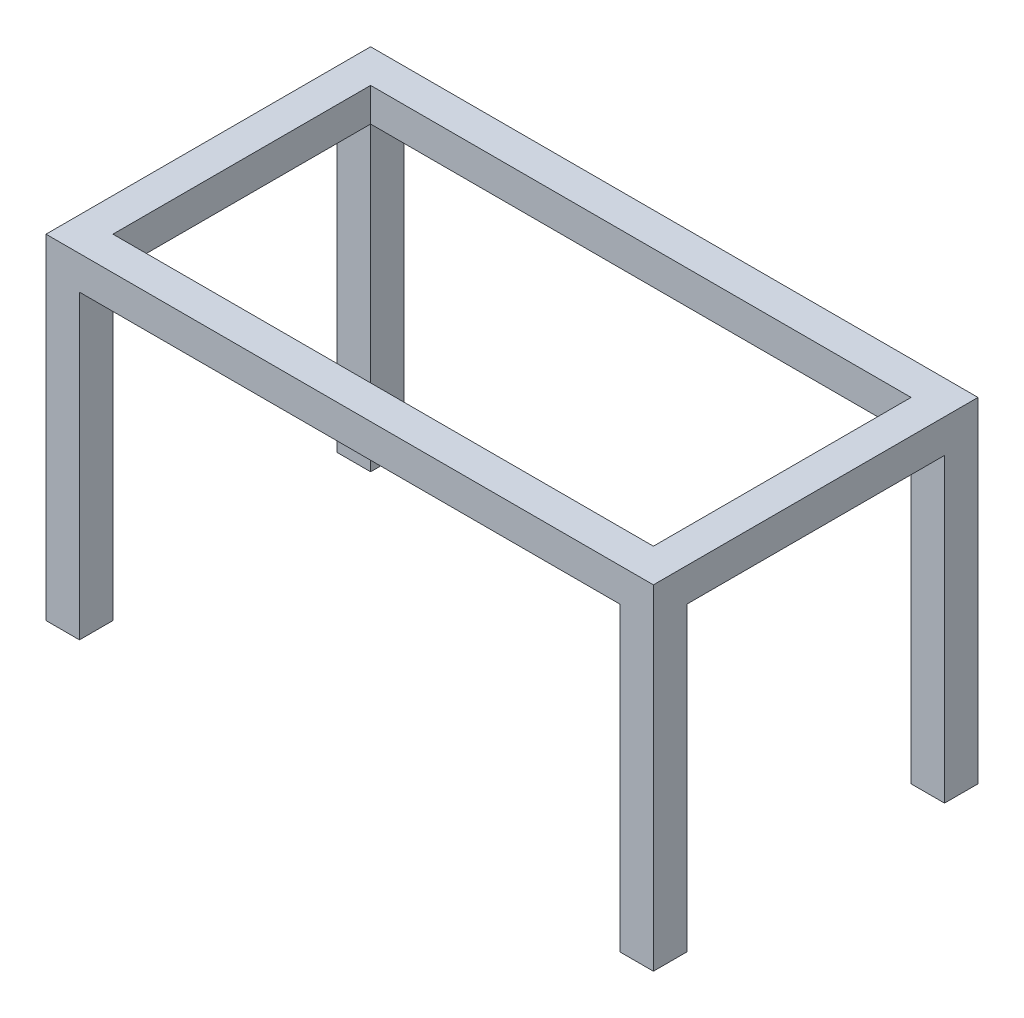
ISO-10303-21;
HEADER;
FILE_DESCRIPTION(('STEP AP214'),'2;1');
FILE_NAME('part.step','',(''),(''),'','','');
FILE_SCHEMA(('AUTOMOTIVE_DESIGN { 1 0 10303 214 1 1 1 1 }'));
ENDSEC;
DATA;
#1=APPLICATION_CONTEXT('core data for automotive mechanical design processes');
#2=APPLICATION_PROTOCOL_DEFINITION('international standard','automotive_design',2000,#1);
#3=PRODUCT_CONTEXT('',#1,'mechanical');
#4=PRODUCT('Part','Part','',(#3));
#5=PRODUCT_RELATED_PRODUCT_CATEGORY('part','',(#4));
#6=PRODUCT_DEFINITION_FORMATION('','',#4);
#7=PRODUCT_DEFINITION_CONTEXT('part definition',#1,'design');
#8=PRODUCT_DEFINITION('design','',#6,#7);
#9=PRODUCT_DEFINITION_SHAPE('','',#8);
#10=(LENGTH_UNIT() NAMED_UNIT(*) SI_UNIT(.MILLI.,.METRE.));
#11=(NAMED_UNIT(*) PLANE_ANGLE_UNIT() SI_UNIT($,.RADIAN.));
#12=(NAMED_UNIT(*) SI_UNIT($,.STERADIAN.) SOLID_ANGLE_UNIT());
#13=UNCERTAINTY_MEASURE_WITH_UNIT(LENGTH_MEASURE(1.E-05),#10,'distance_accuracy_value','');
#14=(GEOMETRIC_REPRESENTATION_CONTEXT(3) GLOBAL_UNCERTAINTY_ASSIGNED_CONTEXT((#13)) GLOBAL_UNIT_ASSIGNED_CONTEXT((#10,
#11,#12)) REPRESENTATION_CONTEXT('',''));
#15=CARTESIAN_POINT('',(0.,0.,0.));
#16=DIRECTION('',(0.,0.,1.));
#17=DIRECTION('',(1.,0.,0.));
#18=AXIS2_PLACEMENT_3D('',#15,#16,#17);
#19=CARTESIAN_POINT('',(-40.375,50.,-19.25));
#20=DIRECTION('',(0.,0.,-1.));
#21=DIRECTION('',(-1.,0.,0.));
#22=AXIS2_PLACEMENT_3D('',#19,#20,#21);
#23=PLANE('',#22);
#24=DIRECTION('',(1.,0.,0.));
#25=VECTOR('',#24,1.);
#26=CARTESIAN_POINT('',(40.375,45.,-19.25));
#27=LINE('',#26,#25);
#28=CARTESIAN_POINT('',(40.375,45.,-19.25));
#29=VERTEX_POINT('',#28);
#30=CARTESIAN_POINT('',(45.375,45.,-19.25));
#31=VERTEX_POINT('',#30);
#32=EDGE_CURVE('E54',#29,#31,#27,.T.);
#33=ORIENTED_EDGE('',*,*,#32,.F.);
#34=DIRECTION('',(0.,-1.,0.));
#35=VECTOR('',#34,1.);
#36=CARTESIAN_POINT('',(40.375,50.,-19.25));
#37=LINE('',#36,#35);
#38=CARTESIAN_POINT('',(40.375,0.,-19.25));
#39=VERTEX_POINT('',#38);
#40=EDGE_CURVE('E243',#29,#39,#37,.T.);
#41=ORIENTED_EDGE('',*,*,#40,.T.);
#42=DIRECTION('',(1.,0.,0.));
#43=VECTOR('',#42,1.);
#44=CARTESIAN_POINT('',(40.375,0.,-19.25));
#45=LINE('',#44,#43);
#46=CARTESIAN_POINT('',(45.375,0.,-19.25));
#47=VERTEX_POINT('',#46);
#48=EDGE_CURVE('E230',#39,#47,#45,.T.);
#49=ORIENTED_EDGE('',*,*,#48,.T.);
#50=DIRECTION('',(0.,-1.,0.));
#51=VECTOR('',#50,1.);
#52=CARTESIAN_POINT('',(45.375,50.,-19.25));
#53=LINE('',#52,#51);
#54=EDGE_CURVE('E241',#31,#47,#53,.T.);
#55=ORIENTED_EDGE('',*,*,#54,.F.);
#56=EDGE_LOOP('',(#33,#41,#49,#55));
#57=FACE_BOUND('',#56,.T.);
#58=ADVANCED_FACE('F37',(#57),#23,.F.);
#59=DIRECTION('',(0.,-1.,0.));
#60=VECTOR('',#59,1.);
#61=CARTESIAN_POINT('',(40.375,45.,-19.25));
#62=LINE('',#61,#60);
#63=CARTESIAN_POINT('',(40.375,50.,-19.25));
#64=VERTEX_POINT('',#63);
#65=EDGE_CURVE('E193',#64,#29,#62,.T.);
#66=ORIENTED_EDGE('',*,*,#65,.F.);
#67=DIRECTION('',(1.,0.,0.));
#68=VECTOR('',#67,1.);
#69=CARTESIAN_POINT('',(-40.375,50.,-19.25));
#70=LINE('',#69,#68);
#71=CARTESIAN_POINT('',(-40.375,50.,-19.25));
#72=VERTEX_POINT('',#71);
#73=EDGE_CURVE('E265',#72,#64,#70,.T.);
#74=ORIENTED_EDGE('',*,*,#73,.F.);
#75=DIRECTION('',(0.,1.,0.));
#76=VECTOR('',#75,1.);
#77=CARTESIAN_POINT('',(-40.375,50.,-19.25));
#78=LINE('',#77,#76);
#79=CARTESIAN_POINT('',(-40.375,45.,-19.25));
#80=VERTEX_POINT('',#79);
#81=EDGE_CURVE('E285',#80,#72,#78,.T.);
#82=ORIENTED_EDGE('',*,*,#81,.F.);
#83=DIRECTION('',(-1.,0.,0.));
#84=VECTOR('',#83,1.);
#85=CARTESIAN_POINT('',(45.377,45.,-19.25));
#86=LINE('',#85,#84);
#87=EDGE_CURVE('E249',#29,#80,#86,.T.);
#88=ORIENTED_EDGE('',*,*,#87,.F.);
#89=EDGE_LOOP('',(#66,#74,#82,#88));
#90=FACE_BOUND('',#89,.T.);
#91=ADVANCED_FACE('F327',(#90),#23,.F.);
#92=CARTESIAN_POINT('',(45.377,50.,19.25));
#93=DIRECTION('',(0.,0.,1.));
#94=DIRECTION('',(1.,0.,0.));
#95=AXIS2_PLACEMENT_3D('',#92,#93,#94);
#96=PLANE('',#95);
#97=DIRECTION('',(1.,0.,0.));
#98=VECTOR('',#97,1.);
#99=CARTESIAN_POINT('',(40.375,45.,19.25));
#100=LINE('',#99,#98);
#101=CARTESIAN_POINT('',(40.375,45.,19.25));
#102=VERTEX_POINT('',#101);
#103=CARTESIAN_POINT('',(45.375,45.,19.25));
#104=VERTEX_POINT('',#103);
#105=EDGE_CURVE('E180',#102,#104,#100,.T.);
#106=ORIENTED_EDGE('',*,*,#105,.T.);
#107=DIRECTION('',(0.,-1.,0.));
#108=VECTOR('',#107,1.);
#109=CARTESIAN_POINT('',(45.375,50.,19.25));
#110=LINE('',#109,#108);
#111=CARTESIAN_POINT('',(45.375,0.,19.25));
#112=VERTEX_POINT('',#111);
#113=EDGE_CURVE('E164',#104,#112,#110,.T.);
#114=ORIENTED_EDGE('',*,*,#113,.T.);
#115=DIRECTION('',(-1.,0.,0.));
#116=VECTOR('',#115,1.);
#117=CARTESIAN_POINT('',(40.375,0.,19.25));
#118=LINE('',#117,#116);
#119=CARTESIAN_POINT('',(40.375,0.,19.25));
#120=VERTEX_POINT('',#119);
#121=EDGE_CURVE('E201',#112,#120,#118,.T.);
#122=ORIENTED_EDGE('',*,*,#121,.T.);
#123=DIRECTION('',(0.,-1.,0.));
#124=VECTOR('',#123,1.);
#125=CARTESIAN_POINT('',(40.375,50.,19.25));
#126=LINE('',#125,#124);
#127=EDGE_CURVE('E175',#102,#120,#126,.T.);
#128=ORIENTED_EDGE('',*,*,#127,.F.);
#129=EDGE_LOOP('',(#106,#114,#122,#128));
#130=FACE_BOUND('',#129,.T.);
#131=ADVANCED_FACE('F181',(#130),#96,.F.);
#132=DIRECTION('',(0.,-1.,0.));
#133=VECTOR('',#132,1.);
#134=CARTESIAN_POINT('',(40.375,50.,19.25));
#135=LINE('',#134,#133);
#136=CARTESIAN_POINT('',(40.375,50.,19.25));
#137=VERTEX_POINT('',#136);
#138=EDGE_CURVE('E183',#137,#102,#135,.T.);
#139=ORIENTED_EDGE('',*,*,#138,.T.);
#140=DIRECTION('',(-1.,0.,0.));
#141=VECTOR('',#140,1.);
#142=CARTESIAN_POINT('',(45.377,45.,19.25));
#143=LINE('',#142,#141);
#144=CARTESIAN_POINT('',(-40.375,45.,19.25));
#145=VERTEX_POINT('',#144);
#146=EDGE_CURVE('E215',#102,#145,#143,.T.);
#147=ORIENTED_EDGE('',*,*,#146,.T.);
#148=DIRECTION('',(0.,1.,0.));
#149=VECTOR('',#148,1.);
#150=CARTESIAN_POINT('',(-40.375,50.,19.25));
#151=LINE('',#150,#149);
#152=CARTESIAN_POINT('',(-40.375,50.,19.25));
#153=VERTEX_POINT('',#152);
#154=EDGE_CURVE('E214',#145,#153,#151,.T.);
#155=ORIENTED_EDGE('',*,*,#154,.T.);
#156=DIRECTION('',(-1.,0.,0.));
#157=VECTOR('',#156,1.);
#158=CARTESIAN_POINT('',(45.377,50.,19.25));
#159=LINE('',#158,#157);
#160=EDGE_CURVE('E62',#137,#153,#159,.T.);
#161=ORIENTED_EDGE('',*,*,#160,.F.);
#162=EDGE_LOOP('',(#139,#147,#155,#161));
#163=FACE_BOUND('',#162,.T.);
#164=ADVANCED_FACE('F430',(#163),#96,.F.);
#165=CARTESIAN_POINT('',(-40.375,50.,19.25));
#166=DIRECTION('',(-1.,0.,0.));
#167=DIRECTION('',(0.,0.,1.));
#168=AXIS2_PLACEMENT_3D('',#165,#166,#167);
#169=PLANE('',#168);
#170=DIRECTION('',(0.,0.,-1.));
#171=VECTOR('',#170,1.);
#172=CARTESIAN_POINT('',(-40.375,45.,24.25));
#173=LINE('',#172,#171);
#174=CARTESIAN_POINT('',(-40.375,45.,24.25));
#175=VERTEX_POINT('',#174);
#176=EDGE_CURVE('E219',#175,#145,#173,.T.);
#177=ORIENTED_EDGE('',*,*,#176,.F.);
#178=DIRECTION('',(0.,-1.,0.));
#179=VECTOR('',#178,1.);
#180=CARTESIAN_POINT('',(-40.375,50.,24.25));
#181=LINE('',#180,#179);
#182=CARTESIAN_POINT('',(-40.375,0.,24.25));
#183=VERTEX_POINT('',#182);
#184=EDGE_CURVE('E304',#175,#183,#181,.T.);
#185=ORIENTED_EDGE('',*,*,#184,.T.);
#186=DIRECTION('',(0.,0.,-1.));
#187=VECTOR('',#186,1.);
#188=CARTESIAN_POINT('',(-40.375,0.,19.25));
#189=LINE('',#188,#187);
#190=CARTESIAN_POINT('',(-40.375,0.,19.25));
#191=VERTEX_POINT('',#190);
#192=EDGE_CURVE('E11',#183,#191,#189,.T.);
#193=ORIENTED_EDGE('',*,*,#192,.T.);
#194=DIRECTION('',(0.,-1.,0.));
#195=VECTOR('',#194,1.);
#196=CARTESIAN_POINT('',(-40.375,50.,19.25));
#197=LINE('',#196,#195);
#198=EDGE_CURVE('E297',#145,#191,#197,.T.);
#199=ORIENTED_EDGE('',*,*,#198,.F.);
#200=EDGE_LOOP('',(#177,#185,#193,#199));
#201=FACE_BOUND('',#200,.T.);
#202=ADVANCED_FACE('F388',(#201),#169,.F.);
#203=ORIENTED_EDGE('',*,*,#154,.F.);
#204=DIRECTION('',(0.,0.,-1.));
#205=VECTOR('',#204,1.);
#206=CARTESIAN_POINT('',(-40.375,45.,24.252));
#207=LINE('',#206,#205);
#208=EDGE_CURVE('E288',#145,#80,#207,.T.);
#209=ORIENTED_EDGE('',*,*,#208,.T.);
#210=ORIENTED_EDGE('',*,*,#81,.T.);
#211=DIRECTION('',(0.,0.,-1.));
#212=VECTOR('',#211,1.);
#213=CARTESIAN_POINT('',(-40.375,50.,19.25));
#214=LINE('',#213,#212);
#215=EDGE_CURVE('E41',#153,#72,#214,.T.);
#216=ORIENTED_EDGE('',*,*,#215,.F.);
#217=EDGE_LOOP('',(#203,#209,#210,#216));
#218=FACE_BOUND('',#217,.T.);
#219=ADVANCED_FACE('F329',(#218),#169,.F.);
#220=CARTESIAN_POINT('',(-40.375,50.,19.25));
#221=DIRECTION('',(0.,0.,1.));
#222=DIRECTION('',(1.,0.,0.));
#223=AXIS2_PLACEMENT_3D('',#220,#221,#222);
#224=PLANE('',#223);
#225=DIRECTION('',(0.,-1.,0.));
#226=VECTOR('',#225,1.);
#227=CARTESIAN_POINT('',(-45.375,50.,19.25));
#228=LINE('',#227,#226);
#229=CARTESIAN_POINT('',(-45.375,45.,19.25));
#230=VERTEX_POINT('',#229);
#231=CARTESIAN_POINT('',(-45.375,0.,19.25));
#232=VERTEX_POINT('',#231);
#233=EDGE_CURVE('E299',#230,#232,#228,.T.);
#234=ORIENTED_EDGE('',*,*,#233,.F.);
#235=DIRECTION('',(1.,0.,0.));
#236=VECTOR('',#235,1.);
#237=CARTESIAN_POINT('',(-45.375,45.,19.25));
#238=LINE('',#237,#236);
#239=EDGE_CURVE('E292',#230,#145,#238,.T.);
#240=ORIENTED_EDGE('',*,*,#239,.T.);
#241=ORIENTED_EDGE('',*,*,#198,.T.);
#242=DIRECTION('',(-1.,0.,0.));
#243=VECTOR('',#242,1.);
#244=CARTESIAN_POINT('',(-40.375,0.,19.25));
#245=LINE('',#244,#243);
#246=EDGE_CURVE('E46',#191,#232,#245,.T.);
#247=ORIENTED_EDGE('',*,*,#246,.T.);
#248=EDGE_LOOP('',(#234,#240,#241,#247));
#249=FACE_BOUND('',#248,.T.);
#250=ADVANCED_FACE('F392',(#249),#224,.F.);
#251=CARTESIAN_POINT('',(-45.375,50.,19.25));
#252=DIRECTION('',(1.,0.,0.));
#253=DIRECTION('',(0.,0.,-1.));
#254=AXIS2_PLACEMENT_3D('',#251,#252,#253);
#255=PLANE('',#254);
#256=DIRECTION('',(0.,0.,1.));
#257=VECTOR('',#256,1.);
#258=CARTESIAN_POINT('',(-45.375,0.,19.25));
#259=LINE('',#258,#257);
#260=CARTESIAN_POINT('',(-45.375,0.,24.25));
#261=VERTEX_POINT('',#260);
#262=EDGE_CURVE('E310',#232,#261,#259,.T.);
#263=ORIENTED_EDGE('',*,*,#262,.T.);
#264=DIRECTION('',(0.,-1.,0.));
#265=VECTOR('',#264,1.);
#266=CARTESIAN_POINT('',(-45.375,50.,24.25));
#267=LINE('',#266,#265);
#268=CARTESIAN_POINT('',(-45.375,50.,24.25));
#269=VERTEX_POINT('',#268);
#270=EDGE_CURVE('E301',#269,#261,#267,.T.);
#271=ORIENTED_EDGE('',*,*,#270,.F.);
#272=DIRECTION('',(0.,0.,1.));
#273=VECTOR('',#272,1.);
#274=CARTESIAN_POINT('',(-45.375,50.,19.25));
#275=LINE('',#274,#273);
#276=CARTESIAN_POINT('',(-45.375,50.,-24.25));
#277=VERTEX_POINT('',#276);
#278=EDGE_CURVE('E315',#277,#269,#275,.T.);
#279=ORIENTED_EDGE('',*,*,#278,.F.);
#280=DIRECTION('',(0.,-1.,0.));
#281=VECTOR('',#280,1.);
#282=CARTESIAN_POINT('',(-45.375,50.,-24.25));
#283=LINE('',#282,#281);
#284=CARTESIAN_POINT('',(-45.375,0.,-24.25));
#285=VERTEX_POINT('',#284);
#286=EDGE_CURVE('E258',#277,#285,#283,.T.);
#287=ORIENTED_EDGE('',*,*,#286,.T.);
#288=DIRECTION('',(0.,0.,1.));
#289=VECTOR('',#288,1.);
#290=CARTESIAN_POINT('',(-45.375,0.,-19.25));
#291=LINE('',#290,#289);
#292=CARTESIAN_POINT('',(-45.375,0.,-19.25));
#293=VERTEX_POINT('',#292);
#294=EDGE_CURVE('E269',#285,#293,#291,.T.);
#295=ORIENTED_EDGE('',*,*,#294,.T.);
#296=DIRECTION('',(0.,-1.,0.));
#297=VECTOR('',#296,1.);
#298=CARTESIAN_POINT('',(-45.375,50.,-19.25));
#299=LINE('',#298,#297);
#300=CARTESIAN_POINT('',(-45.375,45.,-19.25));
#301=VERTEX_POINT('',#300);
#302=EDGE_CURVE('E261',#301,#293,#299,.T.);
#303=ORIENTED_EDGE('',*,*,#302,.F.);
#304=DIRECTION('',(0.,0.,-1.));
#305=VECTOR('',#304,1.);
#306=CARTESIAN_POINT('',(-45.375,45.,24.252));
#307=LINE('',#306,#305);
#308=EDGE_CURVE('E289',#230,#301,#307,.T.);
#309=ORIENTED_EDGE('',*,*,#308,.F.);
#310=ORIENTED_EDGE('',*,*,#233,.T.);
#311=EDGE_LOOP('',(#263,#271,#279,#287,#295,#303,#309,#310));
#312=FACE_BOUND('',#311,.T.);
#313=ADVANCED_FACE('F340',(#312),#255,.F.);
#314=CARTESIAN_POINT('',(-40.375,50.,24.25));
#315=DIRECTION('',(0.,0.,-1.));
#316=DIRECTION('',(-1.,0.,0.));
#317=AXIS2_PLACEMENT_3D('',#314,#315,#316);
#318=PLANE('',#317);
#319=DIRECTION('',(1.,0.,0.));
#320=VECTOR('',#319,1.);
#321=CARTESIAN_POINT('',(-40.375,0.,24.25));
#322=LINE('',#321,#320);
#323=EDGE_CURVE('E307',#261,#183,#322,.T.);
#324=ORIENTED_EDGE('',*,*,#323,.T.);
#325=ORIENTED_EDGE('',*,*,#184,.F.);
#326=DIRECTION('',(-1.,0.,0.));
#327=VECTOR('',#326,1.);
#328=CARTESIAN_POINT('',(45.377,45.,24.25));
#329=LINE('',#328,#327);
#330=CARTESIAN_POINT('',(40.375,45.,24.25));
#331=VERTEX_POINT('',#330);
#332=EDGE_CURVE('E212',#331,#175,#329,.T.);
#333=ORIENTED_EDGE('',*,*,#332,.F.);
#334=DIRECTION('',(0.,-1.,0.));
#335=VECTOR('',#334,1.);
#336=CARTESIAN_POINT('',(40.375,50.,24.25));
#337=LINE('',#336,#335);
#338=CARTESIAN_POINT('',(40.375,0.,24.25));
#339=VERTEX_POINT('',#338);
#340=EDGE_CURVE('E196',#331,#339,#337,.T.);
#341=ORIENTED_EDGE('',*,*,#340,.T.);
#342=DIRECTION('',(1.,0.,0.));
#343=VECTOR('',#342,1.);
#344=CARTESIAN_POINT('',(40.375,0.,24.25));
#345=LINE('',#344,#343);
#346=CARTESIAN_POINT('',(45.375,0.,24.25));
#347=VERTEX_POINT('',#346);
#348=EDGE_CURVE('E204',#339,#347,#345,.T.);
#349=ORIENTED_EDGE('',*,*,#348,.T.);
#350=DIRECTION('',(0.,-1.,0.));
#351=VECTOR('',#350,1.);
#352=CARTESIAN_POINT('',(45.375,50.,24.25));
#353=LINE('',#352,#351);
#354=CARTESIAN_POINT('',(45.375,50.,24.25));
#355=VERTEX_POINT('',#354);
#356=EDGE_CURVE('E176',#355,#347,#353,.T.);
#357=ORIENTED_EDGE('',*,*,#356,.F.);
#358=DIRECTION('',(1.,0.,0.));
#359=VECTOR('',#358,1.);
#360=CARTESIAN_POINT('',(-40.375,50.,24.25));
#361=LINE('',#360,#359);
#362=EDGE_CURVE('E306',#269,#355,#361,.T.);
#363=ORIENTED_EDGE('',*,*,#362,.F.);
#364=ORIENTED_EDGE('',*,*,#270,.T.);
#365=EDGE_LOOP('',(#324,#325,#333,#341,#349,#357,#363,#364));
#366=FACE_BOUND('',#365,.T.);
#367=ADVANCED_FACE('F384',(#366),#318,.F.);
#368=CARTESIAN_POINT('',(0.,50.,0.));
#369=DIRECTION('',(0.,-1.,0.));
#370=DIRECTION('',(0.,0.,-1.));
#371=AXIS2_PLACEMENT_3D('',#368,#369,#370);
#372=PLANE('',#371);
#373=ORIENTED_EDGE('',*,*,#73,.T.);
#374=DIRECTION('',(0.,0.,-1.));
#375=VECTOR('',#374,1.);
#376=CARTESIAN_POINT('',(40.375,50.,24.252));
#377=LINE('',#376,#375);
#378=EDGE_CURVE('E186',#137,#64,#377,.T.);
#379=ORIENTED_EDGE('',*,*,#378,.F.);
#380=ORIENTED_EDGE('',*,*,#160,.T.);
#381=ORIENTED_EDGE('',*,*,#215,.T.);
#382=EDGE_LOOP('',(#373,#379,#380,#381));
#383=FACE_BOUND('',#382,.T.);
#384=ORIENTED_EDGE('',*,*,#362,.T.);
#385=DIRECTION('',(0.,0.,-1.));
#386=VECTOR('',#385,1.);
#387=CARTESIAN_POINT('',(45.375,50.,-19.25));
#388=LINE('',#387,#386);
#389=CARTESIAN_POINT('',(45.375,50.,-24.25));
#390=VERTEX_POINT('',#389);
#391=EDGE_CURVE('E223',#355,#390,#388,.T.);
#392=ORIENTED_EDGE('',*,*,#391,.T.);
#393=DIRECTION('',(-1.,0.,0.));
#394=VECTOR('',#393,1.);
#395=CARTESIAN_POINT('',(-40.375,50.,-24.25));
#396=LINE('',#395,#394);
#397=EDGE_CURVE('E270',#390,#277,#396,.T.);
#398=ORIENTED_EDGE('',*,*,#397,.T.);
#399=ORIENTED_EDGE('',*,*,#278,.T.);
#400=EDGE_LOOP('',(#384,#392,#398,#399));
#401=FACE_BOUND('',#400,.T.);
#402=ADVANCED_FACE('F39',(#383,#401),#372,.F.);
#403=CARTESIAN_POINT('',(0.,0.,0.));
#404=DIRECTION('',(0.,-1.,0.));
#405=DIRECTION('',(0.,0.,-1.));
#406=AXIS2_PLACEMENT_3D('',#403,#404,#405);
#407=PLANE('',#406);
#408=ORIENTED_EDGE('',*,*,#192,.F.);
#409=ORIENTED_EDGE('',*,*,#323,.F.);
#410=ORIENTED_EDGE('',*,*,#262,.F.);
#411=ORIENTED_EDGE('',*,*,#246,.F.);
#412=EDGE_LOOP('',(#408,#409,#410,#411));
#413=FACE_BOUND('',#412,.T.);
#414=ADVANCED_FACE('F395',(#413),#407,.T.);
#415=CARTESIAN_POINT('',(-45.375,45.,24.252));
#416=DIRECTION('',(0.,1.,0.));
#417=DIRECTION('',(0.,0.,1.));
#418=AXIS2_PLACEMENT_3D('',#415,#416,#417);
#419=PLANE('',#418);
#420=ORIENTED_EDGE('',*,*,#239,.F.);
#421=ORIENTED_EDGE('',*,*,#308,.T.);
#422=DIRECTION('',(1.,0.,0.));
#423=VECTOR('',#422,1.);
#424=CARTESIAN_POINT('',(-45.375,45.,-19.25));
#425=LINE('',#424,#423);
#426=EDGE_CURVE('E278',#301,#80,#425,.T.);
#427=ORIENTED_EDGE('',*,*,#426,.T.);
#428=ORIENTED_EDGE('',*,*,#208,.F.);
#429=EDGE_LOOP('',(#420,#421,#427,#428));
#430=FACE_BOUND('',#429,.T.);
#431=ADVANCED_FACE('F332',(#430),#419,.F.);
#432=CARTESIAN_POINT('',(-40.375,50.,-19.25));
#433=DIRECTION('',(-1.,0.,0.));
#434=DIRECTION('',(0.,0.,1.));
#435=AXIS2_PLACEMENT_3D('',#432,#433,#434);
#436=PLANE('',#435);
#437=DIRECTION('',(0.,0.,-1.));
#438=VECTOR('',#437,1.);
#439=CARTESIAN_POINT('',(-40.375,45.,-19.25));
#440=LINE('',#439,#438);
#441=CARTESIAN_POINT('',(-40.375,45.,-24.25));
#442=VERTEX_POINT('',#441);
#443=EDGE_CURVE('E245',#80,#442,#440,.T.);
#444=ORIENTED_EDGE('',*,*,#443,.F.);
#445=DIRECTION('',(0.,-1.,0.));
#446=VECTOR('',#445,1.);
#447=CARTESIAN_POINT('',(-40.375,50.,-19.25));
#448=LINE('',#447,#446);
#449=CARTESIAN_POINT('',(-40.375,0.,-19.25));
#450=VERTEX_POINT('',#449);
#451=EDGE_CURVE('E263',#80,#450,#448,.T.);
#452=ORIENTED_EDGE('',*,*,#451,.T.);
#453=DIRECTION('',(0.,0.,-1.));
#454=VECTOR('',#453,1.);
#455=CARTESIAN_POINT('',(-40.375,0.,-19.25));
#456=LINE('',#455,#454);
#457=CARTESIAN_POINT('',(-40.375,0.,-24.25));
#458=VERTEX_POINT('',#457);
#459=EDGE_CURVE('E275',#450,#458,#456,.T.);
#460=ORIENTED_EDGE('',*,*,#459,.T.);
#461=DIRECTION('',(0.,-1.,0.));
#462=VECTOR('',#461,1.);
#463=CARTESIAN_POINT('',(-40.375,50.,-24.25));
#464=LINE('',#463,#462);
#465=EDGE_CURVE('E256',#442,#458,#464,.T.);
#466=ORIENTED_EDGE('',*,*,#465,.F.);
#467=EDGE_LOOP('',(#444,#452,#460,#466));
#468=FACE_BOUND('',#467,.T.);
#469=ADVANCED_FACE('F350',(#468),#436,.F.);
#470=CARTESIAN_POINT('',(-40.375,50.,-24.25));
#471=DIRECTION('',(0.,0.,1.));
#472=DIRECTION('',(1.,0.,0.));
#473=AXIS2_PLACEMENT_3D('',#470,#471,#472);
#474=PLANE('',#473);
#475=DIRECTION('',(-1.,0.,0.));
#476=VECTOR('',#475,1.);
#477=CARTESIAN_POINT('',(-40.375,0.,-24.25));
#478=LINE('',#477,#476);
#479=EDGE_CURVE('E273',#458,#285,#478,.T.);
#480=ORIENTED_EDGE('',*,*,#479,.T.);
#481=ORIENTED_EDGE('',*,*,#286,.F.);
#482=ORIENTED_EDGE('',*,*,#397,.F.);
#483=DIRECTION('',(0.,-1.,0.));
#484=VECTOR('',#483,1.);
#485=CARTESIAN_POINT('',(45.375,50.,-24.25));
#486=LINE('',#485,#484);
#487=CARTESIAN_POINT('',(45.375,0.,-24.25));
#488=VERTEX_POINT('',#487);
#489=EDGE_CURVE('E238',#390,#488,#486,.T.);
#490=ORIENTED_EDGE('',*,*,#489,.T.);
#491=DIRECTION('',(-1.,0.,0.));
#492=VECTOR('',#491,1.);
#493=CARTESIAN_POINT('',(40.375,0.,-24.25));
#494=LINE('',#493,#492);
#495=CARTESIAN_POINT('',(40.375,0.,-24.25));
#496=VERTEX_POINT('',#495);
#497=EDGE_CURVE('E227',#488,#496,#494,.T.);
#498=ORIENTED_EDGE('',*,*,#497,.T.);
#499=DIRECTION('',(0.,-1.,0.));
#500=VECTOR('',#499,1.);
#501=CARTESIAN_POINT('',(40.375,50.,-24.25));
#502=LINE('',#501,#500);
#503=CARTESIAN_POINT('',(40.375,45.,-24.25));
#504=VERTEX_POINT('',#503);
#505=EDGE_CURVE('E226',#504,#496,#502,.T.);
#506=ORIENTED_EDGE('',*,*,#505,.F.);
#507=DIRECTION('',(-1.,0.,0.));
#508=VECTOR('',#507,1.);
#509=CARTESIAN_POINT('',(45.377,45.,-24.25));
#510=LINE('',#509,#508);
#511=EDGE_CURVE('E248',#504,#442,#510,.T.);
#512=ORIENTED_EDGE('',*,*,#511,.T.);
#513=ORIENTED_EDGE('',*,*,#465,.T.);
#514=EDGE_LOOP('',(#480,#481,#482,#490,#498,#506,#512,#513));
#515=FACE_BOUND('',#514,.T.);
#516=ADVANCED_FACE('F367',(#515),#474,.F.);
#517=ORIENTED_EDGE('',*,*,#426,.F.);
#518=ORIENTED_EDGE('',*,*,#302,.T.);
#519=DIRECTION('',(1.,0.,0.));
#520=VECTOR('',#519,1.);
#521=CARTESIAN_POINT('',(-40.375,0.,-19.25));
#522=LINE('',#521,#520);
#523=EDGE_CURVE('E266',#293,#450,#522,.T.);
#524=ORIENTED_EDGE('',*,*,#523,.T.);
#525=ORIENTED_EDGE('',*,*,#451,.F.);
#526=EDGE_LOOP('',(#517,#518,#524,#525));
#527=FACE_BOUND('',#526,.T.);
#528=ADVANCED_FACE('F337',(#527),#23,.F.);
#529=CARTESIAN_POINT('',(0.,0.,0.));
#530=DIRECTION('',(0.,1.,0.));
#531=DIRECTION('',(0.,0.,1.));
#532=AXIS2_PLACEMENT_3D('',#529,#530,#531);
#533=PLANE('',#532);
#534=ORIENTED_EDGE('',*,*,#459,.F.);
#535=ORIENTED_EDGE('',*,*,#523,.F.);
#536=ORIENTED_EDGE('',*,*,#294,.F.);
#537=ORIENTED_EDGE('',*,*,#479,.F.);
#538=EDGE_LOOP('',(#534,#535,#536,#537));
#539=FACE_BOUND('',#538,.T.);
#540=ADVANCED_FACE('F348',(#539),#533,.F.);
#541=CARTESIAN_POINT('',(45.377,45.,-19.25));
#542=DIRECTION('',(0.,1.,0.));
#543=DIRECTION('',(0.,0.,1.));
#544=AXIS2_PLACEMENT_3D('',#541,#542,#543);
#545=PLANE('',#544);
#546=DIRECTION('',(0.,0.,-1.));
#547=VECTOR('',#546,1.);
#548=CARTESIAN_POINT('',(40.375,45.,-19.25));
#549=LINE('',#548,#547);
#550=EDGE_CURVE('E251',#29,#504,#549,.T.);
#551=ORIENTED_EDGE('',*,*,#550,.F.);
#552=ORIENTED_EDGE('',*,*,#87,.T.);
#553=ORIENTED_EDGE('',*,*,#443,.T.);
#554=ORIENTED_EDGE('',*,*,#511,.F.);
#555=EDGE_LOOP('',(#551,#552,#553,#554));
#556=FACE_BOUND('',#555,.T.);
#557=ADVANCED_FACE('F353',(#556),#545,.F.);
#558=CARTESIAN_POINT('',(40.375,50.,-19.25));
#559=DIRECTION('',(1.,0.,0.));
#560=DIRECTION('',(0.,0.,-1.));
#561=AXIS2_PLACEMENT_3D('',#558,#559,#560);
#562=PLANE('',#561);
#563=ORIENTED_EDGE('',*,*,#40,.F.);
#564=ORIENTED_EDGE('',*,*,#550,.T.);
#565=ORIENTED_EDGE('',*,*,#505,.T.);
#566=DIRECTION('',(0.,0.,1.));
#567=VECTOR('',#566,1.);
#568=CARTESIAN_POINT('',(40.375,0.,-19.25));
#569=LINE('',#568,#567);
#570=EDGE_CURVE('E222',#496,#39,#569,.T.);
#571=ORIENTED_EDGE('',*,*,#570,.T.);
#572=EDGE_LOOP('',(#563,#564,#565,#571));
#573=FACE_BOUND('',#572,.T.);
#574=ADVANCED_FACE('F356',(#573),#562,.F.);
#575=CARTESIAN_POINT('',(45.375,50.,-19.25));
#576=DIRECTION('',(-1.,0.,0.));
#577=DIRECTION('',(0.,0.,1.));
#578=AXIS2_PLACEMENT_3D('',#575,#576,#577);
#579=PLANE('',#578);
#580=DIRECTION('',(0.,0.,-1.));
#581=VECTOR('',#580,1.);
#582=CARTESIAN_POINT('',(45.375,0.,-19.25));
#583=LINE('',#582,#581);
#584=EDGE_CURVE('E233',#47,#488,#583,.T.);
#585=ORIENTED_EDGE('',*,*,#584,.T.);
#586=ORIENTED_EDGE('',*,*,#489,.F.);
#587=ORIENTED_EDGE('',*,*,#391,.F.);
#588=ORIENTED_EDGE('',*,*,#356,.T.);
#589=DIRECTION('',(0.,0.,-1.));
#590=VECTOR('',#589,1.);
#591=CARTESIAN_POINT('',(45.375,0.,19.25));
#592=LINE('',#591,#590);
#593=EDGE_CURVE('E171',#347,#112,#592,.T.);
#594=ORIENTED_EDGE('',*,*,#593,.T.);
#595=ORIENTED_EDGE('',*,*,#113,.F.);
#596=DIRECTION('',(0.,0.,-1.));
#597=VECTOR('',#596,1.);
#598=CARTESIAN_POINT('',(45.375,45.,24.252));
#599=LINE('',#598,#597);
#600=EDGE_CURVE('E167',#104,#31,#599,.T.);
#601=ORIENTED_EDGE('',*,*,#600,.T.);
#602=ORIENTED_EDGE('',*,*,#54,.T.);
#603=EDGE_LOOP('',(#585,#586,#587,#588,#594,#595,#601,#602));
#604=FACE_BOUND('',#603,.T.);
#605=ADVANCED_FACE('F166',(#604),#579,.F.);
#606=CARTESIAN_POINT('',(0.,0.,0.));
#607=DIRECTION('',(0.,-1.,0.));
#608=DIRECTION('',(0.,0.,-1.));
#609=AXIS2_PLACEMENT_3D('',#606,#607,#608);
#610=PLANE('',#609);
#611=ORIENTED_EDGE('',*,*,#570,.F.);
#612=ORIENTED_EDGE('',*,*,#497,.F.);
#613=ORIENTED_EDGE('',*,*,#584,.F.);
#614=ORIENTED_EDGE('',*,*,#48,.F.);
#615=EDGE_LOOP('',(#611,#612,#613,#614));
#616=FACE_BOUND('',#615,.T.);
#617=ADVANCED_FACE('F363',(#616),#610,.T.);
#618=CARTESIAN_POINT('',(45.377,45.,24.25));
#619=DIRECTION('',(0.,1.,0.));
#620=DIRECTION('',(0.,0.,1.));
#621=AXIS2_PLACEMENT_3D('',#618,#619,#620);
#622=PLANE('',#621);
#623=DIRECTION('',(0.,0.,-1.));
#624=VECTOR('',#623,1.);
#625=CARTESIAN_POINT('',(40.375,45.,24.25));
#626=LINE('',#625,#624);
#627=EDGE_CURVE('E209',#331,#102,#626,.T.);
#628=ORIENTED_EDGE('',*,*,#627,.F.);
#629=ORIENTED_EDGE('',*,*,#332,.T.);
#630=ORIENTED_EDGE('',*,*,#176,.T.);
#631=ORIENTED_EDGE('',*,*,#146,.F.);
#632=EDGE_LOOP('',(#628,#629,#630,#631));
#633=FACE_BOUND('',#632,.T.);
#634=ADVANCED_FACE('F381',(#633),#622,.F.);
#635=CARTESIAN_POINT('',(40.375,50.,19.25));
#636=DIRECTION('',(1.,0.,0.));
#637=DIRECTION('',(0.,0.,-1.));
#638=AXIS2_PLACEMENT_3D('',#635,#636,#637);
#639=PLANE('',#638);
#640=ORIENTED_EDGE('',*,*,#340,.F.);
#641=ORIENTED_EDGE('',*,*,#627,.T.);
#642=ORIENTED_EDGE('',*,*,#127,.T.);
#643=DIRECTION('',(0.,0.,1.));
#644=VECTOR('',#643,1.);
#645=CARTESIAN_POINT('',(40.375,0.,19.25));
#646=LINE('',#645,#644);
#647=EDGE_CURVE('E206',#120,#339,#646,.T.);
#648=ORIENTED_EDGE('',*,*,#647,.T.);
#649=EDGE_LOOP('',(#640,#641,#642,#648));
#650=FACE_BOUND('',#649,.T.);
#651=ADVANCED_FACE('F377',(#650),#639,.F.);
#652=CARTESIAN_POINT('',(0.,0.,0.));
#653=DIRECTION('',(0.,1.,0.));
#654=DIRECTION('',(0.,0.,1.));
#655=AXIS2_PLACEMENT_3D('',#652,#653,#654);
#656=PLANE('',#655);
#657=ORIENTED_EDGE('',*,*,#647,.F.);
#658=ORIENTED_EDGE('',*,*,#121,.F.);
#659=ORIENTED_EDGE('',*,*,#593,.F.);
#660=ORIENTED_EDGE('',*,*,#348,.F.);
#661=EDGE_LOOP('',(#657,#658,#659,#660));
#662=FACE_BOUND('',#661,.T.);
#663=ADVANCED_FACE('F374',(#662),#656,.F.);
#664=CARTESIAN_POINT('',(40.375,45.,24.252));
#665=DIRECTION('',(0.,1.,0.));
#666=DIRECTION('',(0.,0.,1.));
#667=AXIS2_PLACEMENT_3D('',#664,#665,#666);
#668=PLANE('',#667);
#669=ORIENTED_EDGE('',*,*,#105,.F.);
#670=DIRECTION('',(0.,0.,-1.));
#671=VECTOR('',#670,1.);
#672=CARTESIAN_POINT('',(40.375,45.,24.252));
#673=LINE('',#672,#671);
#674=EDGE_CURVE('E187',#102,#29,#673,.T.);
#675=ORIENTED_EDGE('',*,*,#674,.T.);
#676=ORIENTED_EDGE('',*,*,#32,.T.);
#677=ORIENTED_EDGE('',*,*,#600,.F.);
#678=EDGE_LOOP('',(#669,#675,#676,#677));
#679=FACE_BOUND('',#678,.T.);
#680=ADVANCED_FACE('F185',(#679),#668,.F.);
#681=CARTESIAN_POINT('',(40.375,45.,24.252));
#682=DIRECTION('',(1.,0.,0.));
#683=DIRECTION('',(0.,0.,-1.));
#684=AXIS2_PLACEMENT_3D('',#681,#682,#683);
#685=PLANE('',#684);
#686=ORIENTED_EDGE('',*,*,#138,.F.);
#687=ORIENTED_EDGE('',*,*,#378,.T.);
#688=ORIENTED_EDGE('',*,*,#65,.T.);
#689=ORIENTED_EDGE('',*,*,#674,.F.);
#690=EDGE_LOOP('',(#686,#687,#688,#689));
#691=FACE_BOUND('',#690,.T.);
#692=ADVANCED_FACE('F435',(#691),#685,.F.);
#693=CLOSED_SHELL('',(#58,#91,#131,#164,#202,#219,#250,#313,#367,#402,#414,#431,#469,#516,#528,
#540,#557,#574,#605,#617,#634,#651,#663,#680,#692));
#694=MANIFOLD_SOLID_BREP('B2',#693);
#695=ADVANCED_BREP_SHAPE_REPRESENTATION('',(#18,#694),#14);
#696=SHAPE_DEFINITION_REPRESENTATION(#9,#695);
ENDSEC;
END-ISO-10303-21;
